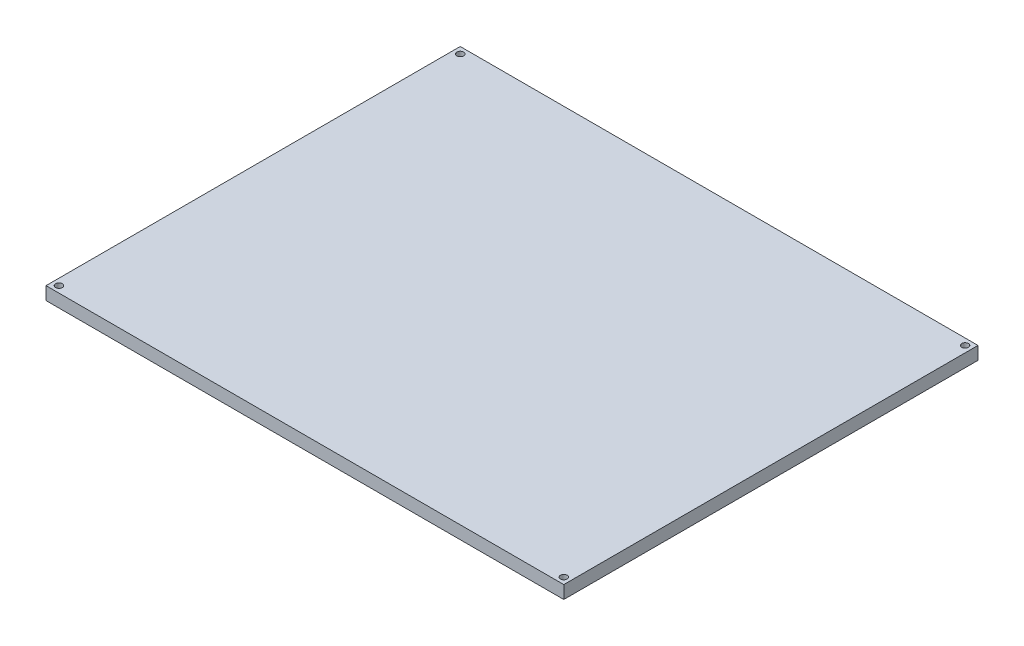
ISO-10303-21;
HEADER;
FILE_DESCRIPTION(('STEP AP214'),'2;1');
FILE_NAME('part.step','',(''),(''),'','','');
FILE_SCHEMA(('AUTOMOTIVE_DESIGN { 1 0 10303 214 1 1 1 1 }'));
ENDSEC;
DATA;
#1=APPLICATION_CONTEXT('core data for automotive mechanical design processes');
#2=APPLICATION_PROTOCOL_DEFINITION('international standard','automotive_design',2000,#1);
#3=PRODUCT_CONTEXT('',#1,'mechanical');
#4=PRODUCT('Part','Part','',(#3));
#5=PRODUCT_RELATED_PRODUCT_CATEGORY('part','',(#4));
#6=PRODUCT_DEFINITION_FORMATION('','',#4);
#7=PRODUCT_DEFINITION_CONTEXT('part definition',#1,'design');
#8=PRODUCT_DEFINITION('design','',#6,#7);
#9=PRODUCT_DEFINITION_SHAPE('','',#8);
#10=(LENGTH_UNIT() NAMED_UNIT(*) SI_UNIT(.MILLI.,.METRE.));
#11=(NAMED_UNIT(*) PLANE_ANGLE_UNIT() SI_UNIT($,.RADIAN.));
#12=(NAMED_UNIT(*) SI_UNIT($,.STERADIAN.) SOLID_ANGLE_UNIT());
#13=UNCERTAINTY_MEASURE_WITH_UNIT(LENGTH_MEASURE(1.E-05),#10,'distance_accuracy_value','');
#14=(GEOMETRIC_REPRESENTATION_CONTEXT(3) GLOBAL_UNCERTAINTY_ASSIGNED_CONTEXT((#13)) GLOBAL_UNIT_ASSIGNED_CONTEXT((#10,
#11,#12)) REPRESENTATION_CONTEXT('',''));
#15=CARTESIAN_POINT('',(0.,0.,0.));
#16=DIRECTION('',(0.,0.,1.));
#17=DIRECTION('',(1.,0.,0.));
#18=AXIS2_PLACEMENT_3D('',#15,#16,#17);
#19=CARTESIAN_POINT('',(127.,6.35,101.6));
#20=DIRECTION('',(-1.,0.,0.));
#21=DIRECTION('',(0.,0.,1.));
#22=AXIS2_PLACEMENT_3D('',#19,#20,#21);
#23=PLANE('',#22);
#24=DIRECTION('',(0.,0.,-1.));
#25=VECTOR('',#24,1.);
#26=CARTESIAN_POINT('',(127.,0.,101.6));
#27=LINE('',#26,#25);
#28=CARTESIAN_POINT('',(127.,0.,101.6));
#29=VERTEX_POINT('',#28);
#30=CARTESIAN_POINT('',(127.,0.,-101.6));
#31=VERTEX_POINT('',#30);
#32=EDGE_CURVE('E113',#29,#31,#27,.T.);
#33=ORIENTED_EDGE('',*,*,#32,.T.);
#34=DIRECTION('',(0.,-1.,0.));
#35=VECTOR('',#34,1.);
#36=CARTESIAN_POINT('',(127.,6.35,-101.6));
#37=LINE('',#36,#35);
#38=CARTESIAN_POINT('',(127.,6.35,-101.6));
#39=VERTEX_POINT('',#38);
#40=EDGE_CURVE('E11',#39,#31,#37,.T.);
#41=ORIENTED_EDGE('',*,*,#40,.F.);
#42=DIRECTION('',(0.,0.,-1.));
#43=VECTOR('',#42,1.);
#44=CARTESIAN_POINT('',(127.,6.35,101.6));
#45=LINE('',#44,#43);
#46=CARTESIAN_POINT('',(127.,6.35,101.6));
#47=VERTEX_POINT('',#46);
#48=EDGE_CURVE('E97',#47,#39,#45,.T.);
#49=ORIENTED_EDGE('',*,*,#48,.F.);
#50=DIRECTION('',(0.,-1.,0.));
#51=VECTOR('',#50,1.);
#52=CARTESIAN_POINT('',(127.,6.35,101.6));
#53=LINE('',#52,#51);
#54=EDGE_CURVE('E109',#47,#29,#53,.T.);
#55=ORIENTED_EDGE('',*,*,#54,.T.);
#56=EDGE_LOOP('',(#33,#41,#49,#55));
#57=FACE_BOUND('',#56,.T.);
#58=ADVANCED_FACE('F45',(#57),#23,.F.);
#59=CARTESIAN_POINT('',(-127.,6.35,-101.6));
#60=DIRECTION('',(0.,0.,1.));
#61=DIRECTION('',(1.,0.,0.));
#62=AXIS2_PLACEMENT_3D('',#59,#60,#61);
#63=PLANE('',#62);
#64=DIRECTION('',(-1.,0.,0.));
#65=VECTOR('',#64,1.);
#66=CARTESIAN_POINT('',(-127.,0.,-101.6));
#67=LINE('',#66,#65);
#68=CARTESIAN_POINT('',(-127.,0.,-101.6));
#69=VERTEX_POINT('',#68);
#70=EDGE_CURVE('E102',#31,#69,#67,.T.);
#71=ORIENTED_EDGE('',*,*,#70,.T.);
#72=DIRECTION('',(0.,-1.,0.));
#73=VECTOR('',#72,1.);
#74=CARTESIAN_POINT('',(-127.,6.35,-101.6));
#75=LINE('',#74,#73);
#76=CARTESIAN_POINT('',(-127.,6.35,-101.6));
#77=VERTEX_POINT('',#76);
#78=EDGE_CURVE('E54',#77,#69,#75,.T.);
#79=ORIENTED_EDGE('',*,*,#78,.F.);
#80=DIRECTION('',(-1.,0.,0.));
#81=VECTOR('',#80,1.);
#82=CARTESIAN_POINT('',(-127.,6.35,-101.6));
#83=LINE('',#82,#81);
#84=EDGE_CURVE('E92',#39,#77,#83,.T.);
#85=ORIENTED_EDGE('',*,*,#84,.F.);
#86=ORIENTED_EDGE('',*,*,#40,.T.);
#87=EDGE_LOOP('',(#71,#79,#85,#86));
#88=FACE_BOUND('',#87,.T.);
#89=ADVANCED_FACE('F101',(#88),#63,.F.);
#90=CARTESIAN_POINT('',(-127.,6.35,101.6));
#91=DIRECTION('',(1.,0.,0.));
#92=DIRECTION('',(0.,0.,-1.));
#93=AXIS2_PLACEMENT_3D('',#90,#91,#92);
#94=PLANE('',#93);
#95=DIRECTION('',(0.,0.,1.));
#96=VECTOR('',#95,1.);
#97=CARTESIAN_POINT('',(-127.,0.,101.6));
#98=LINE('',#97,#96);
#99=CARTESIAN_POINT('',(-127.,0.,101.6));
#100=VERTEX_POINT('',#99);
#101=EDGE_CURVE('E79',#69,#100,#98,.T.);
#102=ORIENTED_EDGE('',*,*,#101,.T.);
#103=DIRECTION('',(0.,-1.,0.));
#104=VECTOR('',#103,1.);
#105=CARTESIAN_POINT('',(-127.,6.35,101.6));
#106=LINE('',#105,#104);
#107=CARTESIAN_POINT('',(-127.,6.35,101.6));
#108=VERTEX_POINT('',#107);
#109=EDGE_CURVE('E104',#108,#100,#106,.T.);
#110=ORIENTED_EDGE('',*,*,#109,.F.);
#111=DIRECTION('',(0.,0.,1.));
#112=VECTOR('',#111,1.);
#113=CARTESIAN_POINT('',(-127.,6.35,101.6));
#114=LINE('',#113,#112);
#115=EDGE_CURVE('E95',#77,#108,#114,.T.);
#116=ORIENTED_EDGE('',*,*,#115,.F.);
#117=ORIENTED_EDGE('',*,*,#78,.T.);
#118=EDGE_LOOP('',(#102,#110,#116,#117));
#119=FACE_BOUND('',#118,.T.);
#120=ADVANCED_FACE('F105',(#119),#94,.F.);
#121=CARTESIAN_POINT('',(-127.,6.35,101.6));
#122=DIRECTION('',(0.,0.,-1.));
#123=DIRECTION('',(-1.,0.,0.));
#124=AXIS2_PLACEMENT_3D('',#121,#122,#123);
#125=PLANE('',#124);
#126=DIRECTION('',(1.,0.,0.));
#127=VECTOR('',#126,1.);
#128=CARTESIAN_POINT('',(-127.,0.,101.6));
#129=LINE('',#128,#127);
#130=EDGE_CURVE('E85',#100,#29,#129,.T.);
#131=ORIENTED_EDGE('',*,*,#130,.T.);
#132=ORIENTED_EDGE('',*,*,#54,.F.);
#133=DIRECTION('',(1.,0.,0.));
#134=VECTOR('',#133,1.);
#135=CARTESIAN_POINT('',(-127.,6.35,101.6));
#136=LINE('',#135,#134);
#137=EDGE_CURVE('E62',#108,#47,#136,.T.);
#138=ORIENTED_EDGE('',*,*,#137,.F.);
#139=ORIENTED_EDGE('',*,*,#109,.T.);
#140=EDGE_LOOP('',(#131,#132,#138,#139));
#141=FACE_BOUND('',#140,.T.);
#142=ADVANCED_FACE('F127',(#141),#125,.F.);
#143=CARTESIAN_POINT('',(0.,6.35,0.));
#144=DIRECTION('',(0.,-1.,0.));
#145=DIRECTION('',(0.,0.,-1.));
#146=AXIS2_PLACEMENT_3D('',#143,#144,#145);
#147=PLANE('',#146);
#148=CARTESIAN_POINT('',(-123.825,6.35,-98.425));
#149=DIRECTION('',(0.,1.,0.));
#150=DIRECTION('',(0.,0.,1.));
#151=AXIS2_PLACEMENT_3D('',#148,#149,#150);
#152=CIRCLE('',#151,1.65);
#153=CARTESIAN_POINT('',(-123.825,6.35,-96.775));
#154=VERTEX_POINT('',#153);
#155=EDGE_CURVE('E146',#154,#154,#152,.T.);
#156=ORIENTED_EDGE('',*,*,#155,.F.);
#157=EDGE_LOOP('',(#156));
#158=FACE_BOUND('',#157,.T.);
#159=CARTESIAN_POINT('',(-123.825,6.35,98.425));
#160=DIRECTION('',(0.,1.,0.));
#161=DIRECTION('',(0.,0.,1.));
#162=AXIS2_PLACEMENT_3D('',#159,#160,#161);
#163=CIRCLE('',#162,1.65);
#164=CARTESIAN_POINT('',(-123.825,6.35,100.075));
#165=VERTEX_POINT('',#164);
#166=EDGE_CURVE('E154',#165,#165,#163,.T.);
#167=ORIENTED_EDGE('',*,*,#166,.F.);
#168=EDGE_LOOP('',(#167));
#169=FACE_BOUND('',#168,.T.);
#170=CARTESIAN_POINT('',(123.825,6.35,98.425));
#171=DIRECTION('',(0.,1.,0.));
#172=DIRECTION('',(0.,0.,1.));
#173=AXIS2_PLACEMENT_3D('',#170,#171,#172);
#174=CIRCLE('',#173,1.65);
#175=CARTESIAN_POINT('',(123.825,6.35,100.075));
#176=VERTEX_POINT('',#175);
#177=EDGE_CURVE('E138',#176,#176,#174,.T.);
#178=ORIENTED_EDGE('',*,*,#177,.F.);
#179=EDGE_LOOP('',(#178));
#180=FACE_BOUND('',#179,.T.);
#181=CARTESIAN_POINT('',(123.825,6.35,-98.425));
#182=DIRECTION('',(0.,1.,0.));
#183=DIRECTION('',(0.,0.,1.));
#184=AXIS2_PLACEMENT_3D('',#181,#182,#183);
#185=CIRCLE('',#184,1.65);
#186=CARTESIAN_POINT('',(123.825,6.35,-96.775));
#187=VERTEX_POINT('',#186);
#188=EDGE_CURVE('E134',#187,#187,#185,.T.);
#189=ORIENTED_EDGE('',*,*,#188,.F.);
#190=EDGE_LOOP('',(#189));
#191=FACE_BOUND('',#190,.T.);
#192=ORIENTED_EDGE('',*,*,#48,.T.);
#193=ORIENTED_EDGE('',*,*,#84,.T.);
#194=ORIENTED_EDGE('',*,*,#115,.T.);
#195=ORIENTED_EDGE('',*,*,#137,.T.);
#196=EDGE_LOOP('',(#192,#193,#194,#195));
#197=FACE_BOUND('',#196,.T.);
#198=ADVANCED_FACE('F93',(#158,#169,#180,#191,#197),#147,.F.);
#199=CARTESIAN_POINT('',(0.,0.,0.));
#200=DIRECTION('',(0.,-1.,0.));
#201=DIRECTION('',(0.,0.,-1.));
#202=AXIS2_PLACEMENT_3D('',#199,#200,#201);
#203=PLANE('',#202);
#204=CARTESIAN_POINT('',(-123.825,0.,-98.425));
#205=DIRECTION('',(0.,1.,0.));
#206=DIRECTION('',(0.,0.,1.));
#207=AXIS2_PLACEMENT_3D('',#204,#205,#206);
#208=CIRCLE('',#207,1.65);
#209=CARTESIAN_POINT('',(-123.825,0.,-96.775));
#210=VERTEX_POINT('',#209);
#211=EDGE_CURVE('E142',#210,#210,#208,.T.);
#212=ORIENTED_EDGE('',*,*,#211,.T.);
#213=EDGE_LOOP('',(#212));
#214=FACE_BOUND('',#213,.T.);
#215=CARTESIAN_POINT('',(-123.825,0.,98.425));
#216=DIRECTION('',(0.,1.,0.));
#217=DIRECTION('',(0.,0.,1.));
#218=AXIS2_PLACEMENT_3D('',#215,#216,#217);
#219=CIRCLE('',#218,1.65);
#220=CARTESIAN_POINT('',(-123.825,0.,100.075));
#221=VERTEX_POINT('',#220);
#222=EDGE_CURVE('E150',#221,#221,#219,.T.);
#223=ORIENTED_EDGE('',*,*,#222,.T.);
#224=EDGE_LOOP('',(#223));
#225=FACE_BOUND('',#224,.T.);
#226=CARTESIAN_POINT('',(123.825,0.,98.425));
#227=DIRECTION('',(0.,1.,0.));
#228=DIRECTION('',(0.,0.,1.));
#229=AXIS2_PLACEMENT_3D('',#226,#227,#228);
#230=CIRCLE('',#229,1.65);
#231=CARTESIAN_POINT('',(123.825,0.,100.075));
#232=VERTEX_POINT('',#231);
#233=EDGE_CURVE('E158',#232,#232,#230,.T.);
#234=ORIENTED_EDGE('',*,*,#233,.T.);
#235=EDGE_LOOP('',(#234));
#236=FACE_BOUND('',#235,.T.);
#237=CARTESIAN_POINT('',(123.825,0.,-98.425));
#238=DIRECTION('',(0.,1.,0.));
#239=DIRECTION('',(0.,0.,1.));
#240=AXIS2_PLACEMENT_3D('',#237,#238,#239);
#241=CIRCLE('',#240,1.65);
#242=CARTESIAN_POINT('',(123.825,0.,-96.775));
#243=VERTEX_POINT('',#242);
#244=EDGE_CURVE('E117',#243,#243,#241,.T.);
#245=ORIENTED_EDGE('',*,*,#244,.T.);
#246=EDGE_LOOP('',(#245));
#247=FACE_BOUND('',#246,.T.);
#248=ORIENTED_EDGE('',*,*,#32,.F.);
#249=ORIENTED_EDGE('',*,*,#130,.F.);
#250=ORIENTED_EDGE('',*,*,#101,.F.);
#251=ORIENTED_EDGE('',*,*,#70,.F.);
#252=EDGE_LOOP('',(#248,#249,#250,#251));
#253=FACE_BOUND('',#252,.T.);
#254=ADVANCED_FACE('F130',(#214,#225,#236,#247,#253),#203,.T.);
#255=CARTESIAN_POINT('',(123.825,0.,-98.425));
#256=DIRECTION('',(0.,1.,0.));
#257=DIRECTION('',(0.,0.,1.));
#258=AXIS2_PLACEMENT_3D('',#255,#256,#257);
#259=CYLINDRICAL_SURFACE('',#258,1.65);
#260=ORIENTED_EDGE('',*,*,#244,.F.);
#261=EDGE_LOOP('',(#260));
#262=FACE_BOUND('',#261,.T.);
#263=ORIENTED_EDGE('',*,*,#188,.T.);
#264=EDGE_LOOP('',(#263));
#265=FACE_BOUND('',#264,.T.);
#266=ADVANCED_FACE('F174',(#262,#265),#259,.F.);
#267=CARTESIAN_POINT('',(123.825,0.,98.425));
#268=DIRECTION('',(0.,1.,0.));
#269=DIRECTION('',(0.,0.,1.));
#270=AXIS2_PLACEMENT_3D('',#267,#268,#269);
#271=CYLINDRICAL_SURFACE('',#270,1.65);
#272=ORIENTED_EDGE('',*,*,#233,.F.);
#273=EDGE_LOOP('',(#272));
#274=FACE_BOUND('',#273,.T.);
#275=ORIENTED_EDGE('',*,*,#177,.T.);
#276=EDGE_LOOP('',(#275));
#277=FACE_BOUND('',#276,.T.);
#278=ADVANCED_FACE('F166',(#274,#277),#271,.F.);
#279=CARTESIAN_POINT('',(-123.825,0.,98.425));
#280=DIRECTION('',(0.,1.,0.));
#281=DIRECTION('',(0.,0.,1.));
#282=AXIS2_PLACEMENT_3D('',#279,#280,#281);
#283=CYLINDRICAL_SURFACE('',#282,1.65);
#284=ORIENTED_EDGE('',*,*,#222,.F.);
#285=EDGE_LOOP('',(#284));
#286=FACE_BOUND('',#285,.T.);
#287=ORIENTED_EDGE('',*,*,#166,.T.);
#288=EDGE_LOOP('',(#287));
#289=FACE_BOUND('',#288,.T.);
#290=ADVANCED_FACE('F182',(#286,#289),#283,.F.);
#291=CARTESIAN_POINT('',(-123.825,0.,-98.425));
#292=DIRECTION('',(0.,1.,0.));
#293=DIRECTION('',(0.,0.,1.));
#294=AXIS2_PLACEMENT_3D('',#291,#292,#293);
#295=CYLINDRICAL_SURFACE('',#294,1.65);
#296=ORIENTED_EDGE('',*,*,#211,.F.);
#297=EDGE_LOOP('',(#296));
#298=FACE_BOUND('',#297,.T.);
#299=ORIENTED_EDGE('',*,*,#155,.T.);
#300=EDGE_LOOP('',(#299));
#301=FACE_BOUND('',#300,.T.);
#302=ADVANCED_FACE('F233',(#298,#301),#295,.F.);
#303=CLOSED_SHELL('',(#58,#89,#120,#142,#198,#254,#266,#278,#290,#302));
#304=MANIFOLD_SOLID_BREP('B2',#303);
#305=ADVANCED_BREP_SHAPE_REPRESENTATION('',(#18,#304),#14);
#306=SHAPE_DEFINITION_REPRESENTATION(#9,#305);
ENDSEC;
END-ISO-10303-21;
